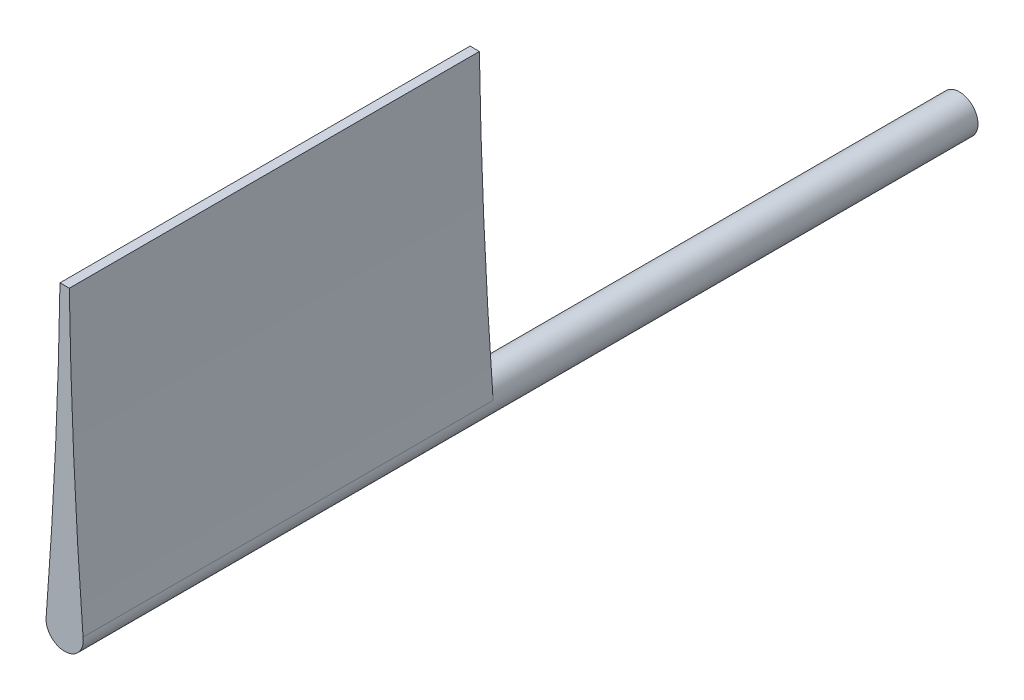
ISO-10303-21;
HEADER;
FILE_DESCRIPTION(('STEP AP214'),'2;1');
FILE_NAME('part.step','',(''),(''),'','','');
FILE_SCHEMA(('AUTOMOTIVE_DESIGN { 1 0 10303 214 1 1 1 1 }'));
ENDSEC;
DATA;
#1=APPLICATION_CONTEXT('core data for automotive mechanical design processes');
#2=APPLICATION_PROTOCOL_DEFINITION('international standard','automotive_design',2000,#1);
#3=PRODUCT_CONTEXT('',#1,'mechanical');
#4=PRODUCT('Part','Part','',(#3));
#5=PRODUCT_RELATED_PRODUCT_CATEGORY('part','',(#4));
#6=PRODUCT_DEFINITION_FORMATION('','',#4);
#7=PRODUCT_DEFINITION_CONTEXT('part definition',#1,'design');
#8=PRODUCT_DEFINITION('design','',#6,#7);
#9=PRODUCT_DEFINITION_SHAPE('','',#8);
#10=(LENGTH_UNIT() NAMED_UNIT(*) SI_UNIT(.MILLI.,.METRE.));
#11=(NAMED_UNIT(*) PLANE_ANGLE_UNIT() SI_UNIT($,.RADIAN.));
#12=(NAMED_UNIT(*) SI_UNIT($,.STERADIAN.) SOLID_ANGLE_UNIT());
#13=UNCERTAINTY_MEASURE_WITH_UNIT(LENGTH_MEASURE(1.E-05),#10,'distance_accuracy_value','');
#14=(GEOMETRIC_REPRESENTATION_CONTEXT(3) GLOBAL_UNCERTAINTY_ASSIGNED_CONTEXT((#13)) GLOBAL_UNIT_ASSIGNED_CONTEXT((#10,
#11,#12)) REPRESENTATION_CONTEXT('',''));
#15=CARTESIAN_POINT('',(0.,0.,0.));
#16=DIRECTION('',(0.,0.,1.));
#17=DIRECTION('',(1.,0.,0.));
#18=AXIS2_PLACEMENT_3D('',#15,#16,#17);
#19=CARTESIAN_POINT('',(-10.,0.,-25.6060606060606));
#20=CARTESIAN_POINT('',(-8.95879009338204,13.3235891189606,-25.6060606060606));
#21=CARTESIAN_POINT('',(-7.29258014605962,39.9805097688263,-25.6060606060606));
#22=CARTESIAN_POINT('',(-6.45879009338205,66.656922452294,-25.6060606060606));
#23=CARTESIAN_POINT('',(-6.25,80.,-25.6060606060606));
#24=CARTESIAN_POINT('',(-9.99999999999999,0.,11.060606060606));
#25=CARTESIAN_POINT('',(-8.95879009338204,13.3235891189606,11.060606060606));
#26=CARTESIAN_POINT('',(-7.29258014605962,39.9805097688263,11.0606060606061));
#27=CARTESIAN_POINT('',(-6.45879009338205,66.656922452294,11.060606060606));
#28=CARTESIAN_POINT('',(-6.25,80.,11.060606060606));
#29=CARTESIAN_POINT('',(-9.99999999999999,0.,47.7272727272727));
#30=CARTESIAN_POINT('',(-8.95879009338204,13.3235891189606,47.7272727272727));
#31=CARTESIAN_POINT('',(-7.29258014605962,39.9805097688263,47.7272727272727));
#32=CARTESIAN_POINT('',(-6.45879009338205,66.656922452294,47.7272727272727));
#33=CARTESIAN_POINT('',(-6.25,80.,47.7272727272727));
#34=CARTESIAN_POINT('',(-9.99999999999999,0.,84.3939393939393));
#35=CARTESIAN_POINT('',(-8.95879009338204,13.3235891189606,84.3939393939393));
#36=CARTESIAN_POINT('',(-7.29258014605962,39.9805097688263,84.3939393939394));
#37=CARTESIAN_POINT('',(-6.45879009338205,66.656922452294,84.3939393939393));
#38=CARTESIAN_POINT('',(-6.25,80.,84.3939393939393));
#39=B_SPLINE_SURFACE_WITH_KNOTS('',3,3,((#19,#20,#21,#22,#23),(#24,#25,#26,#27,#28),(#29,#30,
#31,#32,#33),(#34,#35,#36,#37,#38)),.UNSPECIFIED.,.F.,.F.,.F.,(4,4),(4,1,4),(0.,1.),(0.,
0.500274072899545,1.),.UNSPECIFIED.);
#40=CARTESIAN_POINT('',(-10.,0.,-25.6060606060606));
#41=CARTESIAN_POINT('',(-8.95879009338204,13.3235891189606,-25.6060606060606));
#42=CARTESIAN_POINT('',(-7.29258014605962,39.9805097688263,-25.6060606060606));
#43=CARTESIAN_POINT('',(-6.45879009338205,66.656922452294,-25.6060606060606));
#44=CARTESIAN_POINT('',(-6.25,80.,-25.6060606060606));
#45=B_SPLINE_CURVE_WITH_KNOTS('',3,(#40,#41,#42,#43,#44),.UNSPECIFIED.,.F.,.F.,(4,1,4),(0.,
0.500274072899545,1.),.UNSPECIFIED.);
#46=CARTESIAN_POINT('',(-6.25,80.,-25.6060606060606));
#47=VERTEX_POINT('',#46);
#48=CARTESIAN_POINT('',(-9.93976689545,0.773759018439389,-25.6060606060606));
#49=VERTEX_POINT('',#48);
#50=EDGE_CURVE('E125',#47,#49,#45,.F.);
#51=DIRECTION('',(0.,0.,1.));
#52=VECTOR('',#51,1.);
#53=CARTESIAN_POINT('',(-9.93976689544998,0.773759018439461,29.3939393939394));
#54=LINE('',#53,#52);
#55=CARTESIAN_POINT('',(-9.93976689544997,0.773759018439546,84.3939393939393));
#56=VERTEX_POINT('',#55);
#57=EDGE_CURVE('E113',#49,#56,#54,.T.);
#58=CARTESIAN_POINT('',(-9.99999999999999,0.,84.3939393939393));
#59=CARTESIAN_POINT('',(-8.95879009338204,13.3235891189606,84.3939393939393));
#60=CARTESIAN_POINT('',(-7.29258014605962,39.9805097688263,84.3939393939394));
#61=CARTESIAN_POINT('',(-6.45879009338205,66.656922452294,84.3939393939393));
#62=CARTESIAN_POINT('',(-6.25,80.,84.3939393939393));
#63=B_SPLINE_CURVE_WITH_KNOTS('',3,(#58,#59,#60,#61,#62),.UNSPECIFIED.,.F.,.F.,(4,1,4),(0.,
0.500274072899545,1.),.UNSPECIFIED.);
#64=CARTESIAN_POINT('',(-6.25,80.,84.3939393939393));
#65=VERTEX_POINT('',#64);
#66=EDGE_CURVE('E60',#56,#65,#63,.T.);
#67=DIRECTION('',(0.,0.,1.));
#68=VECTOR('',#67,1.);
#69=CARTESIAN_POINT('',(-6.25,80.,-25.6060606060606));
#70=LINE('',#69,#68);
#71=EDGE_CURVE('E161',#47,#65,#70,.T.);
#72=ORIENTED_EDGE('',*,*,#50,.T.);
#73=ORIENTED_EDGE('',*,*,#57,.T.);
#74=ORIENTED_EDGE('',*,*,#66,.T.);
#75=ORIENTED_EDGE('',*,*,#71,.F.);
#76=EDGE_LOOP('',(#72,#73,#74,#75));
#77=FACE_BOUND('',#76,.T.);
#78=ADVANCED_FACE('F55',(#77),#39,.T.);
#79=CARTESIAN_POINT('',(0.,0.,84.3939393939393));
#80=CARTESIAN_POINT('',(-1.04120990661795,13.3235891189606,84.3939393939393));
#81=CARTESIAN_POINT('',(-2.70741985394036,39.9805097688263,84.3939393939394));
#82=CARTESIAN_POINT('',(-3.54120990661795,66.656922452294,84.3939393939393));
#83=CARTESIAN_POINT('',(-3.75,80.,84.3939393939393));
#84=CARTESIAN_POINT('',(0.,0.,47.7272727272727));
#85=CARTESIAN_POINT('',(-1.04120990661795,13.3235891189606,47.7272727272727));
#86=CARTESIAN_POINT('',(-2.70741985394036,39.9805097688263,47.7272727272727));
#87=CARTESIAN_POINT('',(-3.54120990661795,66.656922452294,47.7272727272727));
#88=CARTESIAN_POINT('',(-3.75,80.,47.7272727272727));
#89=CARTESIAN_POINT('',(0.,0.,11.060606060606));
#90=CARTESIAN_POINT('',(-1.04120990661795,13.3235891189606,11.060606060606));
#91=CARTESIAN_POINT('',(-2.70741985394036,39.9805097688263,11.060606060606));
#92=CARTESIAN_POINT('',(-3.54120990661795,66.656922452294,11.060606060606));
#93=CARTESIAN_POINT('',(-3.75,80.,11.060606060606));
#94=CARTESIAN_POINT('',(0.,0.,-25.6060606060606));
#95=CARTESIAN_POINT('',(-1.04120990661795,13.3235891189606,-25.6060606060606));
#96=CARTESIAN_POINT('',(-2.70741985394036,39.9805097688263,-25.6060606060606));
#97=CARTESIAN_POINT('',(-3.54120990661795,66.656922452294,-25.6060606060606));
#98=CARTESIAN_POINT('',(-3.75,80.,-25.6060606060606));
#99=B_SPLINE_SURFACE_WITH_KNOTS('',3,3,((#79,#80,#81,#82,#83),(#84,#85,#86,#87,#88),(#89,#90,
#91,#92,#93),(#94,#95,#96,#97,#98)),.UNSPECIFIED.,.F.,.F.,.F.,(4,4),(4,1,4),(0.,1.),(0.,
0.500274072899545,1.),.UNSPECIFIED.);
#100=CARTESIAN_POINT('',(0.,0.,84.3939393939393));
#101=CARTESIAN_POINT('',(-1.04120990661795,13.3235891189606,84.3939393939393));
#102=CARTESIAN_POINT('',(-2.70741985394036,39.9805097688263,84.3939393939394));
#103=CARTESIAN_POINT('',(-3.54120990661795,66.656922452294,84.3939393939393));
#104=CARTESIAN_POINT('',(-3.75,80.,84.3939393939393));
#105=B_SPLINE_CURVE_WITH_KNOTS('',3,(#100,#101,#102,#103,#104),.UNSPECIFIED.,.F.,.F.,(4,1,4),
(0.,0.500274072899545,1.),.UNSPECIFIED.);
#106=CARTESIAN_POINT('',(-0.0602331045498512,0.773759018438427,84.3939393939393));
#107=VERTEX_POINT('',#106);
#108=CARTESIAN_POINT('',(-3.75,80.,84.3939393939393));
#109=VERTEX_POINT('',#108);
#110=EDGE_CURVE('E75',#107,#109,#105,.T.);
#111=DIRECTION('',(0.,0.,-1.));
#112=VECTOR('',#111,1.);
#113=CARTESIAN_POINT('',(-0.0602331045499993,0.773759018439372,29.3939393939394));
#114=LINE('',#113,#112);
#115=CARTESIAN_POINT('',(-0.0602331045500273,0.773759018439549,-25.6060606060606));
#116=VERTEX_POINT('',#115);
#117=EDGE_CURVE('E105',#107,#116,#114,.T.);
#118=CARTESIAN_POINT('',(0.,0.,-25.6060606060606));
#119=CARTESIAN_POINT('',(-1.04120990661795,13.3235891189606,-25.6060606060606));
#120=CARTESIAN_POINT('',(-2.70741985394036,39.9805097688263,-25.6060606060606));
#121=CARTESIAN_POINT('',(-3.54120990661795,66.656922452294,-25.6060606060606));
#122=CARTESIAN_POINT('',(-3.75,80.,-25.6060606060606));
#123=B_SPLINE_CURVE_WITH_KNOTS('',3,(#118,#119,#120,#121,#122),.UNSPECIFIED.,.F.,.F.,(4,1,4),
(0.,0.500274072899545,1.),.UNSPECIFIED.);
#124=CARTESIAN_POINT('',(-3.75,80.,-25.6060606060606));
#125=VERTEX_POINT('',#124);
#126=EDGE_CURVE('E121',#116,#125,#123,.T.);
#127=DIRECTION('',(0.,0.,-1.));
#128=VECTOR('',#127,1.);
#129=CARTESIAN_POINT('',(-3.75,80.,-25.6060606060606));
#130=LINE('',#129,#128);
#131=EDGE_CURVE('E118',#109,#125,#130,.T.);
#132=ORIENTED_EDGE('',*,*,#110,.F.);
#133=ORIENTED_EDGE('',*,*,#117,.T.);
#134=ORIENTED_EDGE('',*,*,#126,.T.);
#135=ORIENTED_EDGE('',*,*,#131,.F.);
#136=EDGE_LOOP('',(#132,#133,#134,#135));
#137=FACE_BOUND('',#136,.T.);
#138=ADVANCED_FACE('F116',(#137),#99,.T.);
#139=CARTESIAN_POINT('',(0.,80.,0.));
#140=DIRECTION('',(0.,-1.,0.));
#141=DIRECTION('',(0.,0.,-1.));
#142=AXIS2_PLACEMENT_3D('',#139,#140,#141);
#143=PLANE('',#142);
#144=ORIENTED_EDGE('',*,*,#131,.T.);
#145=DIRECTION('',(-1.,0.,0.));
#146=VECTOR('',#145,1.);
#147=CARTESIAN_POINT('',(-6.25,80.,-25.6060606060606));
#148=LINE('',#147,#146);
#149=EDGE_CURVE('E67',#125,#47,#148,.T.);
#150=ORIENTED_EDGE('',*,*,#149,.T.);
#151=ORIENTED_EDGE('',*,*,#71,.T.);
#152=DIRECTION('',(1.,0.,0.));
#153=VECTOR('',#152,1.);
#154=CARTESIAN_POINT('',(-3.75,80.,84.3939393939393));
#155=LINE('',#154,#153);
#156=EDGE_CURVE('E157',#65,#109,#155,.T.);
#157=ORIENTED_EDGE('',*,*,#156,.T.);
#158=EDGE_LOOP('',(#144,#150,#151,#157));
#159=FACE_BOUND('',#158,.T.);
#160=ADVANCED_FACE('F57',(#159),#143,.F.);
#161=CARTESIAN_POINT('',(-9.99999999999999,0.,84.3939393939393));
#162=DIRECTION('',(0.,0.,1.));
#163=DIRECTION('',(1.,0.,0.));
#164=AXIS2_PLACEMENT_3D('',#161,#162,#163);
#165=PLANE('',#164);
#166=ORIENTED_EDGE('',*,*,#66,.F.);
#167=CARTESIAN_POINT('',(-5.,0.,84.3939393939393));
#168=DIRECTION('',(0.,0.,1.));
#169=DIRECTION('',(1.,0.,0.));
#170=AXIS2_PLACEMENT_3D('',#167,#168,#169);
#171=CIRCLE('',#170,5.);
#172=EDGE_CURVE('E100',#56,#107,#171,.T.);
#173=ORIENTED_EDGE('',*,*,#172,.T.);
#174=ORIENTED_EDGE('',*,*,#110,.T.);
#175=ORIENTED_EDGE('',*,*,#156,.F.);
#176=EDGE_LOOP('',(#166,#173,#174,#175));
#177=FACE_BOUND('',#176,.T.);
#178=ADVANCED_FACE('F102',(#177),#165,.T.);
#179=CARTESIAN_POINT('',(0.,0.,-25.6060606060606));
#180=DIRECTION('',(0.,0.,-1.));
#181=DIRECTION('',(-1.,0.,0.));
#182=AXIS2_PLACEMENT_3D('',#179,#180,#181);
#183=PLANE('',#182);
#184=CARTESIAN_POINT('',(-4.99999999999999,0.,-25.6060606060606));
#185=DIRECTION('',(0.,0.,-1.));
#186=DIRECTION('',(-1.,0.,0.));
#187=AXIS2_PLACEMENT_3D('',#184,#185,#186);
#188=CIRCLE('',#187,5.00000000000001);
#189=EDGE_CURVE('E12',#49,#116,#188,.T.);
#190=ORIENTED_EDGE('',*,*,#189,.F.);
#191=ORIENTED_EDGE('',*,*,#50,.F.);
#192=ORIENTED_EDGE('',*,*,#149,.F.);
#193=ORIENTED_EDGE('',*,*,#126,.F.);
#194=EDGE_LOOP('',(#190,#191,#192,#193));
#195=FACE_BOUND('',#194,.T.);
#196=ADVANCED_FACE('F197',(#195),#183,.T.);
#197=CARTESIAN_POINT('',(-4.99999999999999,0.,-155.606060606061));
#198=DIRECTION('',(0.,0.,1.));
#199=DIRECTION('',(1.,0.,0.));
#200=AXIS2_PLACEMENT_3D('',#197,#198,#199);
#201=CYLINDRICAL_SURFACE('',#200,5.00000000000001);
#202=ORIENTED_EDGE('',*,*,#117,.F.);
#203=ORIENTED_EDGE('',*,*,#172,.F.);
#204=ORIENTED_EDGE('',*,*,#57,.F.);
#205=ORIENTED_EDGE('',*,*,#189,.T.);
#206=EDGE_LOOP('',(#202,#203,#204,#205));
#207=FACE_BOUND('',#206,.T.);
#208=CARTESIAN_POINT('',(-4.99999999999999,0.,-155.606060606061));
#209=DIRECTION('',(0.,0.,-1.));
#210=DIRECTION('',(-1.,0.,0.));
#211=AXIS2_PLACEMENT_3D('',#208,#209,#210);
#212=CIRCLE('',#211,5.00000000000001);
#213=CARTESIAN_POINT('',(-10.,0.,-155.606060606061));
#214=VERTEX_POINT('',#213);
#215=EDGE_CURVE('E199',#214,#214,#212,.T.);
#216=ORIENTED_EDGE('',*,*,#215,.F.);
#217=EDGE_LOOP('',(#216));
#218=FACE_BOUND('',#217,.T.);
#219=ADVANCED_FACE('F107',(#207,#218),#201,.T.);
#220=CARTESIAN_POINT('',(-4.99999999999999,0.,-155.606060606061));
#221=DIRECTION('',(0.,0.,-1.));
#222=DIRECTION('',(-1.,0.,0.));
#223=AXIS2_PLACEMENT_3D('',#220,#221,#222);
#224=PLANE('',#223);
#225=ORIENTED_EDGE('',*,*,#215,.T.);
#226=EDGE_LOOP('',(#225));
#227=FACE_BOUND('',#226,.T.);
#228=ADVANCED_FACE('F208',(#227),#224,.T.);
#229=CLOSED_SHELL('',(#78,#138,#160,#178,#196,#219,#228));
#230=MANIFOLD_SOLID_BREP('B2',#229);
#231=ADVANCED_BREP_SHAPE_REPRESENTATION('',(#18,#230),#14);
#232=SHAPE_DEFINITION_REPRESENTATION(#9,#231);
ENDSEC;
END-ISO-10303-21;
